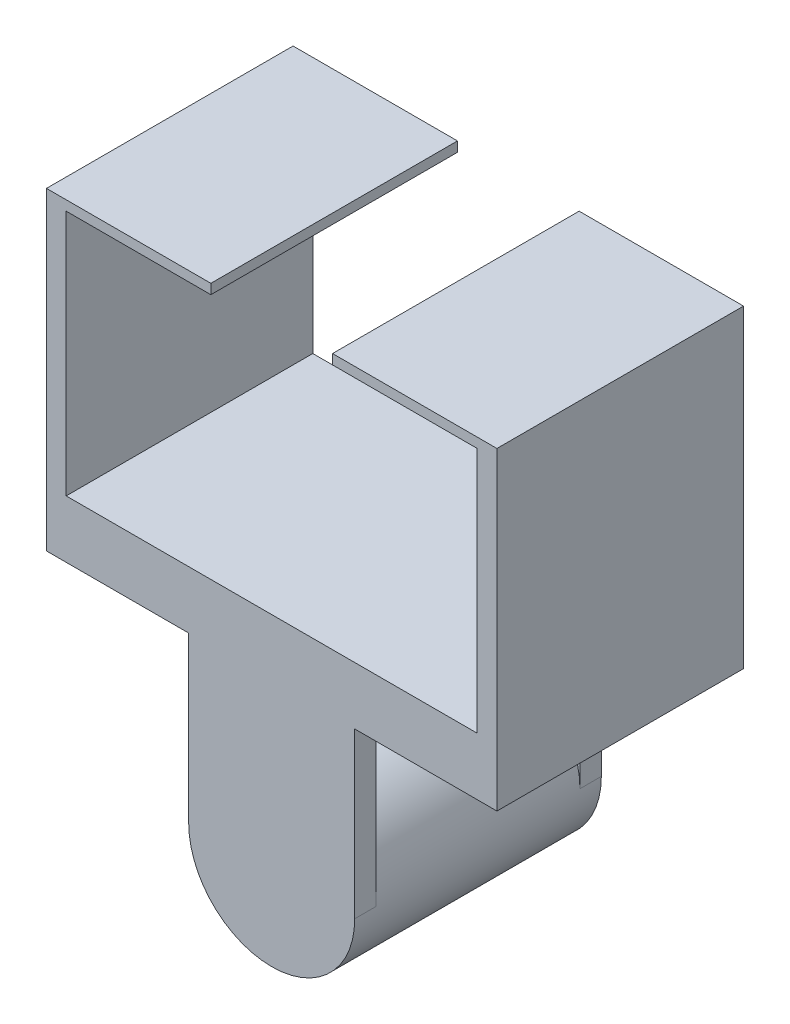
ISO-10303-21;
HEADER;
FILE_DESCRIPTION(('STEP AP214'),'2;1');
FILE_NAME('part.step','',(''),(''),'','','');
FILE_SCHEMA(('AUTOMOTIVE_DESIGN { 1 0 10303 214 1 1 1 1 }'));
ENDSEC;
DATA;
#1=APPLICATION_CONTEXT('core data for automotive mechanical design processes');
#2=APPLICATION_PROTOCOL_DEFINITION('international standard','automotive_design',2000,#1);
#3=PRODUCT_CONTEXT('',#1,'mechanical');
#4=PRODUCT('Part','Part','',(#3));
#5=PRODUCT_RELATED_PRODUCT_CATEGORY('part','',(#4));
#6=PRODUCT_DEFINITION_FORMATION('','',#4);
#7=PRODUCT_DEFINITION_CONTEXT('part definition',#1,'design');
#8=PRODUCT_DEFINITION('design','',#6,#7);
#9=PRODUCT_DEFINITION_SHAPE('','',#8);
#10=(LENGTH_UNIT() NAMED_UNIT(*) SI_UNIT(.MILLI.,.METRE.));
#11=(NAMED_UNIT(*) PLANE_ANGLE_UNIT() SI_UNIT($,.RADIAN.));
#12=(NAMED_UNIT(*) SI_UNIT($,.STERADIAN.) SOLID_ANGLE_UNIT());
#13=UNCERTAINTY_MEASURE_WITH_UNIT(LENGTH_MEASURE(1.E-05),#10,'distance_accuracy_value','');
#14=(GEOMETRIC_REPRESENTATION_CONTEXT(3) GLOBAL_UNCERTAINTY_ASSIGNED_CONTEXT((#13)) GLOBAL_UNIT_ASSIGNED_CONTEXT((#10,
#11,#12)) REPRESENTATION_CONTEXT('',''));
#15=CARTESIAN_POINT('',(0.,0.,0.));
#16=DIRECTION('',(0.,0.,1.));
#17=DIRECTION('',(1.,0.,0.));
#18=AXIS2_PLACEMENT_3D('',#15,#16,#17);
#19=CARTESIAN_POINT('',(0.,-30.1017640511618,38.1));
#20=DIRECTION('',(0.,0.,-1.));
#21=DIRECTION('',(-1.,0.,0.));
#22=AXIS2_PLACEMENT_3D('',#19,#20,#21);
#23=CYLINDRICAL_SURFACE('',#22,12.827);
#24=CARTESIAN_POINT('',(0.,-30.1017640511618,38.1));
#25=DIRECTION('',(0.,0.,1.));
#26=DIRECTION('',(1.,0.,0.));
#27=AXIS2_PLACEMENT_3D('',#24,#25,#26);
#28=CIRCLE('',#27,12.827);
#29=CARTESIAN_POINT('',(-12.827,-30.1017640511618,38.1));
#30=VERTEX_POINT('',#29);
#31=CARTESIAN_POINT('',(12.827,-30.1017640511618,38.1));
#32=VERTEX_POINT('',#31);
#33=EDGE_CURVE('E55',#30,#32,#28,.T.);
#34=ORIENTED_EDGE('',*,*,#33,.F.);
#35=DIRECTION('',(0.,0.,1.));
#36=VECTOR('',#35,1.);
#37=CARTESIAN_POINT('',(-12.827,-30.1017640511618,34.798));
#38=LINE('',#37,#36);
#39=CARTESIAN_POINT('',(-12.827,-30.1017640511618,34.798));
#40=VERTEX_POINT('',#39);
#41=EDGE_CURVE('E206',#40,#30,#38,.T.);
#42=ORIENTED_EDGE('',*,*,#41,.F.);
#43=CARTESIAN_POINT('',(0.,-30.1017640511618,34.798));
#44=DIRECTION('',(0.,0.,-1.));
#45=DIRECTION('',(-1.,0.,0.));
#46=AXIS2_PLACEMENT_3D('',#43,#44,#45);
#47=CIRCLE('',#46,12.827);
#48=CARTESIAN_POINT('',(12.827,-30.1017640511618,34.798));
#49=VERTEX_POINT('',#48);
#50=EDGE_CURVE('E198',#40,#49,#47,.T.);
#51=ORIENTED_EDGE('',*,*,#50,.T.);
#52=DIRECTION('',(0.,0.,1.));
#53=VECTOR('',#52,1.);
#54=CARTESIAN_POINT('',(12.827,-30.1017640511618,34.798));
#55=LINE('',#54,#53);
#56=EDGE_CURVE('E183',#49,#32,#55,.T.);
#57=ORIENTED_EDGE('',*,*,#56,.T.);
#58=EDGE_LOOP('',(#34,#42,#51,#57));
#59=FACE_BOUND('',#58,.T.);
#60=DIRECTION('',(0.,0.,-1.));
#61=VECTOR('',#60,1.);
#62=CARTESIAN_POINT('',(-12.827,-30.1017640511618,3.302));
#63=LINE('',#62,#61);
#64=CARTESIAN_POINT('',(-12.827,-30.1017640511618,3.302));
#65=VERTEX_POINT('',#64);
#66=CARTESIAN_POINT('',(-12.827,-30.1017640511618,0.));
#67=VERTEX_POINT('',#66);
#68=EDGE_CURVE('E375',#65,#67,#63,.T.);
#69=ORIENTED_EDGE('',*,*,#68,.T.);
#70=CARTESIAN_POINT('',(0.,-30.1017640511618,0.));
#71=DIRECTION('',(0.,0.,1.));
#72=DIRECTION('',(1.,0.,0.));
#73=AXIS2_PLACEMENT_3D('',#70,#71,#72);
#74=CIRCLE('',#73,12.827);
#75=CARTESIAN_POINT('',(12.827,-30.1017640511618,0.));
#76=VERTEX_POINT('',#75);
#77=EDGE_CURVE('E379',#67,#76,#74,.T.);
#78=ORIENTED_EDGE('',*,*,#77,.T.);
#79=DIRECTION('',(0.,0.,-1.));
#80=VECTOR('',#79,1.);
#81=CARTESIAN_POINT('',(12.827,-30.1017640511618,3.302));
#82=LINE('',#81,#80);
#83=CARTESIAN_POINT('',(12.827,-30.1017640511618,3.302));
#84=VERTEX_POINT('',#83);
#85=EDGE_CURVE('E371',#84,#76,#82,.T.);
#86=ORIENTED_EDGE('',*,*,#85,.F.);
#87=CARTESIAN_POINT('',(0.,-30.1017640511618,3.302));
#88=DIRECTION('',(0.,0.,-1.));
#89=DIRECTION('',(-1.,0.,0.));
#90=AXIS2_PLACEMENT_3D('',#87,#88,#89);
#91=CIRCLE('',#90,12.827);
#92=EDGE_CURVE('E11',#65,#84,#91,.T.);
#93=ORIENTED_EDGE('',*,*,#92,.F.);
#94=EDGE_LOOP('',(#69,#78,#86,#93));
#95=FACE_BOUND('',#94,.T.);
#96=ADVANCED_FACE('F47',(#59,#95),#23,.T.);
#97=CARTESIAN_POINT('',(0.,-30.1017640511618,38.1));
#98=DIRECTION('',(0.,0.,1.));
#99=DIRECTION('',(1.,0.,0.));
#100=AXIS2_PLACEMENT_3D('',#97,#98,#99);
#101=PLANE('',#100);
#102=ORIENTED_EDGE('',*,*,#33,.T.);
#103=DIRECTION('',(0.,1.,0.));
#104=VECTOR('',#103,1.);
#105=CARTESIAN_POINT('',(12.827,-4.70176405116185,38.1));
#106=LINE('',#105,#104);
#107=CARTESIAN_POINT('',(12.827,-4.70176405116185,38.1));
#108=VERTEX_POINT('',#107);
#109=EDGE_CURVE('E68',#32,#108,#106,.T.);
#110=ORIENTED_EDGE('',*,*,#109,.T.);
#111=DIRECTION('',(1.,0.,0.));
#112=VECTOR('',#111,1.);
#113=CARTESIAN_POINT('',(-31.75,-4.70176405116185,38.1));
#114=LINE('',#113,#112);
#115=CARTESIAN_POINT('',(34.798,-4.70176405116185,38.1));
#116=VERTEX_POINT('',#115);
#117=EDGE_CURVE('E313',#108,#116,#114,.T.);
#118=ORIENTED_EDGE('',*,*,#117,.T.);
#119=DIRECTION('',(0.,-1.,0.));
#120=VECTOR('',#119,1.);
#121=CARTESIAN_POINT('',(34.798,-4.70176405116185,38.1));
#122=LINE('',#121,#120);
#123=CARTESIAN_POINT('',(34.798,43.8122359488382,38.1));
#124=VERTEX_POINT('',#123);
#125=EDGE_CURVE('E301',#124,#116,#122,.T.);
#126=ORIENTED_EDGE('',*,*,#125,.F.);
#127=DIRECTION('',(1.,0.,0.));
#128=VECTOR('',#127,1.);
#129=CARTESIAN_POINT('',(34.798,43.8122359488382,38.1));
#130=LINE('',#129,#128);
#131=CARTESIAN_POINT('',(9.39800000000001,43.8122359488382,38.1));
#132=VERTEX_POINT('',#131);
#133=EDGE_CURVE('E258',#132,#124,#130,.T.);
#134=ORIENTED_EDGE('',*,*,#133,.F.);
#135=DIRECTION('',(0.,-1.,0.));
#136=VECTOR('',#135,1.);
#137=CARTESIAN_POINT('',(9.39800000000001,43.8122359488382,38.1));
#138=LINE('',#137,#136);
#139=CARTESIAN_POINT('',(9.39800000000001,42.2882359488382,38.1));
#140=VERTEX_POINT('',#139);
#141=EDGE_CURVE('E262',#132,#140,#138,.T.);
#142=ORIENTED_EDGE('',*,*,#141,.T.);
#143=DIRECTION('',(1.,0.,0.));
#144=VECTOR('',#143,1.);
#145=CARTESIAN_POINT('',(34.798,42.2882359488382,38.1));
#146=LINE('',#145,#144);
#147=CARTESIAN_POINT('',(31.75,42.2882359488382,38.1));
#148=VERTEX_POINT('',#147);
#149=EDGE_CURVE('E252',#140,#148,#146,.T.);
#150=ORIENTED_EDGE('',*,*,#149,.T.);
#151=DIRECTION('',(0.,-1.,0.));
#152=VECTOR('',#151,1.);
#153=CARTESIAN_POINT('',(31.75,-4.70176405116185,38.1));
#154=LINE('',#153,#152);
#155=CARTESIAN_POINT('',(31.75,4.18823594883815,38.1));
#156=VERTEX_POINT('',#155);
#157=EDGE_CURVE('E291',#148,#156,#154,.T.);
#158=ORIENTED_EDGE('',*,*,#157,.T.);
#159=DIRECTION('',(1.,0.,0.));
#160=VECTOR('',#159,1.);
#161=CARTESIAN_POINT('',(-31.75,4.18823594883815,38.1));
#162=LINE('',#161,#160);
#163=CARTESIAN_POINT('',(-31.75,4.18823594883815,38.1));
#164=VERTEX_POINT('',#163);
#165=EDGE_CURVE('E327',#164,#156,#162,.T.);
#166=ORIENTED_EDGE('',*,*,#165,.F.);
#167=DIRECTION('',(0.,1.,0.));
#168=VECTOR('',#167,1.);
#169=CARTESIAN_POINT('',(-31.75,-4.70176405116185,38.1));
#170=LINE('',#169,#168);
#171=CARTESIAN_POINT('',(-31.75,42.2882359488382,38.1));
#172=VERTEX_POINT('',#171);
#173=EDGE_CURVE('E278',#164,#172,#170,.T.);
#174=ORIENTED_EDGE('',*,*,#173,.T.);
#175=DIRECTION('',(1.,0.,0.));
#176=VECTOR('',#175,1.);
#177=CARTESIAN_POINT('',(-34.798,42.2882359488381,38.1));
#178=LINE('',#177,#176);
#179=CARTESIAN_POINT('',(-9.398,42.2882359488381,38.1));
#180=VERTEX_POINT('',#179);
#181=EDGE_CURVE('E208',#172,#180,#178,.T.);
#182=ORIENTED_EDGE('',*,*,#181,.T.);
#183=DIRECTION('',(0.,-1.,0.));
#184=VECTOR('',#183,1.);
#185=CARTESIAN_POINT('',(-9.398,43.8122359488381,38.1));
#186=LINE('',#185,#184);
#187=CARTESIAN_POINT('',(-9.398,43.8122359488381,38.1));
#188=VERTEX_POINT('',#187);
#189=EDGE_CURVE('E242',#188,#180,#186,.T.);
#190=ORIENTED_EDGE('',*,*,#189,.F.);
#191=DIRECTION('',(1.,0.,0.));
#192=VECTOR('',#191,1.);
#193=CARTESIAN_POINT('',(-34.798,43.8122359488381,38.1));
#194=LINE('',#193,#192);
#195=CARTESIAN_POINT('',(-34.798,43.8122359488381,38.1));
#196=VERTEX_POINT('',#195);
#197=EDGE_CURVE('E222',#196,#188,#194,.T.);
#198=ORIENTED_EDGE('',*,*,#197,.F.);
#199=DIRECTION('',(0.,1.,0.));
#200=VECTOR('',#199,1.);
#201=CARTESIAN_POINT('',(-34.798,-4.70176405116185,38.1));
#202=LINE('',#201,#200);
#203=CARTESIAN_POINT('',(-34.798,-4.70176405116185,38.1));
#204=VERTEX_POINT('',#203);
#205=EDGE_CURVE('E279',#204,#196,#202,.T.);
#206=ORIENTED_EDGE('',*,*,#205,.F.);
#207=CARTESIAN_POINT('',(-12.827,-4.70176405116185,38.1));
#208=VERTEX_POINT('',#207);
#209=EDGE_CURVE('E341',#204,#208,#114,.T.);
#210=ORIENTED_EDGE('',*,*,#209,.T.);
#211=DIRECTION('',(0.,-1.,0.));
#212=VECTOR('',#211,1.);
#213=CARTESIAN_POINT('',(-12.827,-30.1017640511618,38.1));
#214=LINE('',#213,#212);
#215=EDGE_CURVE('E62',#208,#30,#214,.T.);
#216=ORIENTED_EDGE('',*,*,#215,.T.);
#217=EDGE_LOOP('',(#102,#110,#118,#126,#134,#142,#150,#158,#166,#174,#182,#190,#198,#206,#210,#216));
#218=FACE_BOUND('',#217,.T.);
#219=ADVANCED_FACE('F402',(#218),#101,.T.);
#220=CARTESIAN_POINT('',(0.,-30.1017640511618,0.));
#221=DIRECTION('',(0.,0.,1.));
#222=DIRECTION('',(1.,0.,0.));
#223=AXIS2_PLACEMENT_3D('',#220,#221,#222);
#224=PLANE('',#223);
#225=ORIENTED_EDGE('',*,*,#77,.F.);
#226=DIRECTION('',(0.,-1.,0.));
#227=VECTOR('',#226,1.);
#228=CARTESIAN_POINT('',(-12.827,-30.1017640511618,0.));
#229=LINE('',#228,#227);
#230=CARTESIAN_POINT('',(-12.827,-4.70176405116185,0.));
#231=VERTEX_POINT('',#230);
#232=EDGE_CURVE('E340',#231,#67,#229,.T.);
#233=ORIENTED_EDGE('',*,*,#232,.F.);
#234=DIRECTION('',(-1.,0.,0.));
#235=VECTOR('',#234,1.);
#236=CARTESIAN_POINT('',(-31.75,-4.70176405116185,0.));
#237=LINE('',#236,#235);
#238=CARTESIAN_POINT('',(-34.798,-4.70176405116185,0.));
#239=VERTEX_POINT('',#238);
#240=EDGE_CURVE('E344',#231,#239,#237,.T.);
#241=ORIENTED_EDGE('',*,*,#240,.T.);
#242=DIRECTION('',(0.,-1.,0.));
#243=VECTOR('',#242,1.);
#244=CARTESIAN_POINT('',(-34.798,-4.70176405116185,0.));
#245=LINE('',#244,#243);
#246=CARTESIAN_POINT('',(-34.798,43.8122359488382,0.));
#247=VERTEX_POINT('',#246);
#248=EDGE_CURVE('E282',#247,#239,#245,.T.);
#249=ORIENTED_EDGE('',*,*,#248,.F.);
#250=DIRECTION('',(-1.,0.,0.));
#251=VECTOR('',#250,1.);
#252=CARTESIAN_POINT('',(-34.798,43.8122359488382,0.));
#253=LINE('',#252,#251);
#254=CARTESIAN_POINT('',(-9.398,43.8122359488382,0.));
#255=VERTEX_POINT('',#254);
#256=EDGE_CURVE('E229',#255,#247,#253,.T.);
#257=ORIENTED_EDGE('',*,*,#256,.F.);
#258=DIRECTION('',(0.,-1.,0.));
#259=VECTOR('',#258,1.);
#260=CARTESIAN_POINT('',(-9.398,43.8122359488382,0.));
#261=LINE('',#260,#259);
#262=CARTESIAN_POINT('',(-9.398,42.2882359488382,0.));
#263=VERTEX_POINT('',#262);
#264=EDGE_CURVE('E232',#255,#263,#261,.T.);
#265=ORIENTED_EDGE('',*,*,#264,.T.);
#266=DIRECTION('',(-1.,0.,0.));
#267=VECTOR('',#266,1.);
#268=CARTESIAN_POINT('',(-34.798,42.2882359488382,0.));
#269=LINE('',#268,#267);
#270=CARTESIAN_POINT('',(-31.75,42.2882359488382,0.));
#271=VERTEX_POINT('',#270);
#272=EDGE_CURVE('E223',#263,#271,#269,.T.);
#273=ORIENTED_EDGE('',*,*,#272,.T.);
#274=DIRECTION('',(0.,-1.,0.));
#275=VECTOR('',#274,1.);
#276=CARTESIAN_POINT('',(-31.75,-4.70176405116185,0.));
#277=LINE('',#276,#275);
#278=CARTESIAN_POINT('',(-31.75,4.18823594883815,0.));
#279=VERTEX_POINT('',#278);
#280=EDGE_CURVE('E283',#271,#279,#277,.T.);
#281=ORIENTED_EDGE('',*,*,#280,.T.);
#282=DIRECTION('',(-1.,0.,0.));
#283=VECTOR('',#282,1.);
#284=CARTESIAN_POINT('',(-31.75,4.18823594883815,0.));
#285=LINE('',#284,#283);
#286=CARTESIAN_POINT('',(31.75,4.18823594883815,0.));
#287=VERTEX_POINT('',#286);
#288=EDGE_CURVE('E336',#287,#279,#285,.T.);
#289=ORIENTED_EDGE('',*,*,#288,.F.);
#290=DIRECTION('',(0.,1.,0.));
#291=VECTOR('',#290,1.);
#292=CARTESIAN_POINT('',(31.75,-4.70176405116185,0.));
#293=LINE('',#292,#291);
#294=CARTESIAN_POINT('',(31.75,42.2882359488382,0.));
#295=VERTEX_POINT('',#294);
#296=EDGE_CURVE('E317',#287,#295,#293,.T.);
#297=ORIENTED_EDGE('',*,*,#296,.T.);
#298=DIRECTION('',(-1.,0.,0.));
#299=VECTOR('',#298,1.);
#300=CARTESIAN_POINT('',(34.798,42.2882359488382,0.));
#301=LINE('',#300,#299);
#302=CARTESIAN_POINT('',(9.39800000000001,42.2882359488382,0.));
#303=VERTEX_POINT('',#302);
#304=EDGE_CURVE('E246',#295,#303,#301,.T.);
#305=ORIENTED_EDGE('',*,*,#304,.T.);
#306=DIRECTION('',(0.,-1.,0.));
#307=VECTOR('',#306,1.);
#308=CARTESIAN_POINT('',(9.39800000000001,43.8122359488382,0.));
#309=LINE('',#308,#307);
#310=CARTESIAN_POINT('',(9.39800000000001,43.8122359488382,0.));
#311=VERTEX_POINT('',#310);
#312=EDGE_CURVE('E274',#311,#303,#309,.T.);
#313=ORIENTED_EDGE('',*,*,#312,.F.);
#314=DIRECTION('',(-1.,0.,0.));
#315=VECTOR('',#314,1.);
#316=CARTESIAN_POINT('',(34.798,43.8122359488382,0.));
#317=LINE('',#316,#315);
#318=CARTESIAN_POINT('',(34.798,43.8122359488382,0.));
#319=VERTEX_POINT('',#318);
#320=EDGE_CURVE('E251',#319,#311,#317,.T.);
#321=ORIENTED_EDGE('',*,*,#320,.F.);
#322=DIRECTION('',(0.,1.,0.));
#323=VECTOR('',#322,1.);
#324=CARTESIAN_POINT('',(34.798,-4.70176405116185,0.));
#325=LINE('',#324,#323);
#326=CARTESIAN_POINT('',(34.798,-4.70176405116185,0.));
#327=VERTEX_POINT('',#326);
#328=EDGE_CURVE('E310',#327,#319,#325,.T.);
#329=ORIENTED_EDGE('',*,*,#328,.F.);
#330=CARTESIAN_POINT('',(12.827,-4.70176405116185,0.));
#331=VERTEX_POINT('',#330);
#332=EDGE_CURVE('E328',#327,#331,#237,.T.);
#333=ORIENTED_EDGE('',*,*,#332,.T.);
#334=DIRECTION('',(0.,1.,0.));
#335=VECTOR('',#334,1.);
#336=CARTESIAN_POINT('',(12.827,-30.1017640511618,0.));
#337=LINE('',#336,#335);
#338=EDGE_CURVE('E353',#76,#331,#337,.T.);
#339=ORIENTED_EDGE('',*,*,#338,.F.);
#340=EDGE_LOOP('',(#225,#233,#241,#249,#257,#265,#273,#281,#289,#297,#305,#313,#321,#329,#333,#339));
#341=FACE_BOUND('',#340,.T.);
#342=ADVANCED_FACE('F390',(#341),#224,.F.);
#343=CARTESIAN_POINT('',(-12.827,-30.1017640511618,3.302));
#344=DIRECTION('',(1.,0.,0.));
#345=DIRECTION('',(0.,0.,-1.));
#346=AXIS2_PLACEMENT_3D('',#343,#344,#345);
#347=PLANE('',#346);
#348=ORIENTED_EDGE('',*,*,#232,.T.);
#349=ORIENTED_EDGE('',*,*,#68,.F.);
#350=DIRECTION('',(0.,-1.,0.));
#351=VECTOR('',#350,1.);
#352=CARTESIAN_POINT('',(-12.827,-30.1017640511618,3.302));
#353=LINE('',#352,#351);
#354=CARTESIAN_POINT('',(-12.827,-4.70176405116185,3.302));
#355=VERTEX_POINT('',#354);
#356=EDGE_CURVE('E348',#355,#65,#353,.T.);
#357=ORIENTED_EDGE('',*,*,#356,.F.);
#358=DIRECTION('',(0.,0.,-1.));
#359=VECTOR('',#358,1.);
#360=CARTESIAN_POINT('',(-12.827,-4.70176405116185,3.302));
#361=LINE('',#360,#359);
#362=EDGE_CURVE('E359',#355,#231,#361,.T.);
#363=ORIENTED_EDGE('',*,*,#362,.T.);
#364=EDGE_LOOP('',(#348,#349,#357,#363));
#365=FACE_BOUND('',#364,.T.);
#366=ADVANCED_FACE('F478',(#365),#347,.F.);
#367=CARTESIAN_POINT('',(12.827,-30.1017640511618,3.302));
#368=DIRECTION('',(-1.,0.,0.));
#369=DIRECTION('',(0.,0.,1.));
#370=AXIS2_PLACEMENT_3D('',#367,#368,#369);
#371=PLANE('',#370);
#372=ORIENTED_EDGE('',*,*,#338,.T.);
#373=DIRECTION('',(0.,0.,-1.));
#374=VECTOR('',#373,1.);
#375=CARTESIAN_POINT('',(12.827,-4.70176405116185,3.302));
#376=LINE('',#375,#374);
#377=CARTESIAN_POINT('',(12.827,-4.70176405116185,3.302));
#378=VERTEX_POINT('',#377);
#379=EDGE_CURVE('E367',#378,#331,#376,.T.);
#380=ORIENTED_EDGE('',*,*,#379,.F.);
#381=DIRECTION('',(0.,1.,0.));
#382=VECTOR('',#381,1.);
#383=CARTESIAN_POINT('',(12.827,-30.1017640511618,3.302));
#384=LINE('',#383,#382);
#385=EDGE_CURVE('E352',#84,#378,#384,.T.);
#386=ORIENTED_EDGE('',*,*,#385,.F.);
#387=ORIENTED_EDGE('',*,*,#85,.T.);
#388=EDGE_LOOP('',(#372,#380,#386,#387));
#389=FACE_BOUND('',#388,.T.);
#390=ADVANCED_FACE('F388',(#389),#371,.F.);
#391=CARTESIAN_POINT('',(0.,0.,3.302));
#392=DIRECTION('',(0.,0.,-1.));
#393=DIRECTION('',(-1.,0.,0.));
#394=AXIS2_PLACEMENT_3D('',#391,#392,#393);
#395=PLANE('',#394);
#396=ORIENTED_EDGE('',*,*,#356,.T.);
#397=ORIENTED_EDGE('',*,*,#92,.T.);
#398=ORIENTED_EDGE('',*,*,#385,.T.);
#399=DIRECTION('',(-1.,0.,0.));
#400=VECTOR('',#399,1.);
#401=CARTESIAN_POINT('',(-12.827,-4.70176405116185,3.302));
#402=LINE('',#401,#400);
#403=EDGE_CURVE('E356',#378,#355,#402,.T.);
#404=ORIENTED_EDGE('',*,*,#403,.T.);
#405=EDGE_LOOP('',(#396,#397,#398,#404));
#406=FACE_BOUND('',#405,.T.);
#407=ADVANCED_FACE('F485',(#406),#395,.F.);
#408=CARTESIAN_POINT('',(0.,4.18823594883815,0.));
#409=DIRECTION('',(0.,1.,0.));
#410=DIRECTION('',(0.,0.,1.));
#411=AXIS2_PLACEMENT_3D('',#408,#409,#410);
#412=PLANE('',#411);
#413=DIRECTION('',(0.,0.,1.));
#414=VECTOR('',#413,1.);
#415=CARTESIAN_POINT('',(-31.75,4.18823594883815,0.));
#416=LINE('',#415,#414);
#417=EDGE_CURVE('E323',#279,#164,#416,.T.);
#418=ORIENTED_EDGE('',*,*,#417,.T.);
#419=ORIENTED_EDGE('',*,*,#165,.T.);
#420=DIRECTION('',(0.,0.,-1.));
#421=VECTOR('',#420,1.);
#422=CARTESIAN_POINT('',(31.75,4.18823594883815,0.));
#423=LINE('',#422,#421);
#424=EDGE_CURVE('E332',#156,#287,#423,.T.);
#425=ORIENTED_EDGE('',*,*,#424,.T.);
#426=ORIENTED_EDGE('',*,*,#288,.T.);
#427=EDGE_LOOP('',(#418,#419,#425,#426));
#428=FACE_BOUND('',#427,.T.);
#429=ADVANCED_FACE('F420',(#428),#412,.T.);
#430=CARTESIAN_POINT('',(0.,-4.70176405116185,0.));
#431=DIRECTION('',(0.,1.,0.));
#432=DIRECTION('',(0.,0.,1.));
#433=AXIS2_PLACEMENT_3D('',#430,#431,#432);
#434=PLANE('',#433);
#435=DIRECTION('',(-1.,0.,0.));
#436=VECTOR('',#435,1.);
#437=CARTESIAN_POINT('',(-12.827,-4.70176405116185,34.798));
#438=LINE('',#437,#436);
#439=CARTESIAN_POINT('',(12.827,-4.70176405116185,34.798));
#440=VERTEX_POINT('',#439);
#441=CARTESIAN_POINT('',(-12.827,-4.70176405116185,34.798));
#442=VERTEX_POINT('',#441);
#443=EDGE_CURVE('E201',#440,#442,#438,.T.);
#444=ORIENTED_EDGE('',*,*,#443,.T.);
#445=DIRECTION('',(0.,0.,1.));
#446=VECTOR('',#445,1.);
#447=CARTESIAN_POINT('',(-12.827,-4.70176405116185,34.798));
#448=LINE('',#447,#446);
#449=EDGE_CURVE('E214',#442,#208,#448,.T.);
#450=ORIENTED_EDGE('',*,*,#449,.T.);
#451=ORIENTED_EDGE('',*,*,#209,.F.);
#452=DIRECTION('',(0.,0.,1.));
#453=VECTOR('',#452,1.);
#454=CARTESIAN_POINT('',(-34.798,-4.70176405116185,38.1));
#455=LINE('',#454,#453);
#456=EDGE_CURVE('E287',#239,#204,#455,.T.);
#457=ORIENTED_EDGE('',*,*,#456,.F.);
#458=ORIENTED_EDGE('',*,*,#240,.F.);
#459=ORIENTED_EDGE('',*,*,#362,.F.);
#460=ORIENTED_EDGE('',*,*,#403,.F.);
#461=ORIENTED_EDGE('',*,*,#379,.T.);
#462=ORIENTED_EDGE('',*,*,#332,.F.);
#463=DIRECTION('',(0.,0.,-1.));
#464=VECTOR('',#463,1.);
#465=CARTESIAN_POINT('',(34.798,-4.70176405116185,38.1));
#466=LINE('',#465,#464);
#467=EDGE_CURVE('E305',#116,#327,#466,.T.);
#468=ORIENTED_EDGE('',*,*,#467,.F.);
#469=ORIENTED_EDGE('',*,*,#117,.F.);
#470=DIRECTION('',(0.,0.,1.));
#471=VECTOR('',#470,1.);
#472=CARTESIAN_POINT('',(12.827,-4.70176405116185,34.798));
#473=LINE('',#472,#471);
#474=EDGE_CURVE('E192',#440,#108,#473,.T.);
#475=ORIENTED_EDGE('',*,*,#474,.F.);
#476=EDGE_LOOP('',(#444,#450,#451,#457,#458,#459,#460,#461,#462,#468,#469,#475));
#477=FACE_BOUND('',#476,.T.);
#478=ADVANCED_FACE('F395',(#477),#434,.F.);
#479=CARTESIAN_POINT('',(31.75,0.,0.));
#480=DIRECTION('',(-1.,0.,0.));
#481=DIRECTION('',(0.,0.,1.));
#482=AXIS2_PLACEMENT_3D('',#479,#480,#481);
#483=PLANE('',#482);
#484=ORIENTED_EDGE('',*,*,#424,.F.);
#485=ORIENTED_EDGE('',*,*,#157,.F.);
#486=DIRECTION('',(0.,0.,1.));
#487=VECTOR('',#486,1.);
#488=CARTESIAN_POINT('',(31.75,42.2882359488382,38.1));
#489=LINE('',#488,#487);
#490=EDGE_CURVE('E306',#295,#148,#489,.T.);
#491=ORIENTED_EDGE('',*,*,#490,.F.);
#492=ORIENTED_EDGE('',*,*,#296,.F.);
#493=EDGE_LOOP('',(#484,#485,#491,#492));
#494=FACE_BOUND('',#493,.T.);
#495=ADVANCED_FACE('F417',(#494),#483,.T.);
#496=CARTESIAN_POINT('',(34.798,0.,0.));
#497=DIRECTION('',(-1.,0.,0.));
#498=DIRECTION('',(0.,0.,1.));
#499=AXIS2_PLACEMENT_3D('',#496,#497,#498);
#500=PLANE('',#499);
#501=ORIENTED_EDGE('',*,*,#125,.T.);
#502=ORIENTED_EDGE('',*,*,#467,.T.);
#503=ORIENTED_EDGE('',*,*,#328,.T.);
#504=DIRECTION('',(0.,0.,-1.));
#505=VECTOR('',#504,1.);
#506=CARTESIAN_POINT('',(34.798,43.8122359488382,38.1));
#507=LINE('',#506,#505);
#508=EDGE_CURVE('E247',#124,#319,#507,.T.);
#509=ORIENTED_EDGE('',*,*,#508,.F.);
#510=EDGE_LOOP('',(#501,#502,#503,#509));
#511=FACE_BOUND('',#510,.T.);
#512=ADVANCED_FACE('F399',(#511),#500,.F.);
#513=CARTESIAN_POINT('',(-34.798,0.,0.));
#514=DIRECTION('',(-1.,0.,0.));
#515=DIRECTION('',(0.,0.,1.));
#516=AXIS2_PLACEMENT_3D('',#513,#514,#515);
#517=PLANE('',#516);
#518=ORIENTED_EDGE('',*,*,#205,.T.);
#519=DIRECTION('',(0.,0.,1.));
#520=VECTOR('',#519,1.);
#521=CARTESIAN_POINT('',(-34.798,43.8122359488381,38.1));
#522=LINE('',#521,#520);
#523=EDGE_CURVE('E218',#247,#196,#522,.T.);
#524=ORIENTED_EDGE('',*,*,#523,.F.);
#525=ORIENTED_EDGE('',*,*,#248,.T.);
#526=ORIENTED_EDGE('',*,*,#456,.T.);
#527=EDGE_LOOP('',(#518,#524,#525,#526));
#528=FACE_BOUND('',#527,.T.);
#529=ADVANCED_FACE('F442',(#528),#517,.T.);
#530=CARTESIAN_POINT('',(-31.75,0.,0.));
#531=DIRECTION('',(-1.,0.,0.));
#532=DIRECTION('',(0.,0.,1.));
#533=AXIS2_PLACEMENT_3D('',#530,#531,#532);
#534=PLANE('',#533);
#535=ORIENTED_EDGE('',*,*,#417,.F.);
#536=ORIENTED_EDGE('',*,*,#280,.F.);
#537=DIRECTION('',(0.,0.,-1.));
#538=VECTOR('',#537,1.);
#539=CARTESIAN_POINT('',(-31.75,42.2882359488382,38.1));
#540=LINE('',#539,#538);
#541=EDGE_CURVE('E294',#172,#271,#540,.T.);
#542=ORIENTED_EDGE('',*,*,#541,.F.);
#543=ORIENTED_EDGE('',*,*,#173,.F.);
#544=EDGE_LOOP('',(#535,#536,#542,#543));
#545=FACE_BOUND('',#544,.T.);
#546=ADVANCED_FACE('F423',(#545),#534,.F.);
#547=CARTESIAN_POINT('',(9.39800000000001,43.8122359488382,38.1));
#548=DIRECTION('',(1.,0.,0.));
#549=DIRECTION('',(0.,0.,-1.));
#550=AXIS2_PLACEMENT_3D('',#547,#548,#549);
#551=PLANE('',#550);
#552=DIRECTION('',(0.,0.,1.));
#553=VECTOR('',#552,1.);
#554=CARTESIAN_POINT('',(9.39800000000001,42.2882359488382,38.1));
#555=LINE('',#554,#553);
#556=EDGE_CURVE('E265',#303,#140,#555,.T.);
#557=ORIENTED_EDGE('',*,*,#556,.T.);
#558=ORIENTED_EDGE('',*,*,#141,.F.);
#559=DIRECTION('',(0.,0.,1.));
#560=VECTOR('',#559,1.);
#561=CARTESIAN_POINT('',(9.39800000000001,43.8122359488382,38.1));
#562=LINE('',#561,#560);
#563=EDGE_CURVE('E255',#311,#132,#562,.T.);
#564=ORIENTED_EDGE('',*,*,#563,.F.);
#565=ORIENTED_EDGE('',*,*,#312,.T.);
#566=EDGE_LOOP('',(#557,#558,#564,#565));
#567=FACE_BOUND('',#566,.T.);
#568=ADVANCED_FACE('F409',(#567),#551,.F.);
#569=CARTESIAN_POINT('',(0.,43.8122359488382,0.));
#570=DIRECTION('',(0.,1.,0.));
#571=DIRECTION('',(0.,0.,1.));
#572=AXIS2_PLACEMENT_3D('',#569,#570,#571);
#573=PLANE('',#572);
#574=ORIENTED_EDGE('',*,*,#508,.T.);
#575=ORIENTED_EDGE('',*,*,#320,.T.);
#576=ORIENTED_EDGE('',*,*,#563,.T.);
#577=ORIENTED_EDGE('',*,*,#133,.T.);
#578=EDGE_LOOP('',(#574,#575,#576,#577));
#579=FACE_BOUND('',#578,.T.);
#580=ADVANCED_FACE('F404',(#579),#573,.T.);
#581=CARTESIAN_POINT('',(0.,42.2882359488382,0.));
#582=DIRECTION('',(0.,1.,0.));
#583=DIRECTION('',(0.,0.,1.));
#584=AXIS2_PLACEMENT_3D('',#581,#582,#583);
#585=PLANE('',#584);
#586=ORIENTED_EDGE('',*,*,#490,.T.);
#587=ORIENTED_EDGE('',*,*,#149,.F.);
#588=ORIENTED_EDGE('',*,*,#556,.F.);
#589=ORIENTED_EDGE('',*,*,#304,.F.);
#590=EDGE_LOOP('',(#586,#587,#588,#589));
#591=FACE_BOUND('',#590,.T.);
#592=ADVANCED_FACE('F414',(#591),#585,.F.);
#593=CARTESIAN_POINT('',(0.,42.2882359488382,0.));
#594=DIRECTION('',(0.,-1.,0.));
#595=DIRECTION('',(0.,0.,-1.));
#596=AXIS2_PLACEMENT_3D('',#593,#594,#595);
#597=PLANE('',#596);
#598=ORIENTED_EDGE('',*,*,#541,.T.);
#599=ORIENTED_EDGE('',*,*,#272,.F.);
#600=DIRECTION('',(0.,0.,-1.));
#601=VECTOR('',#600,1.);
#602=CARTESIAN_POINT('',(-9.398,42.2882359488381,38.1));
#603=LINE('',#602,#601);
#604=EDGE_CURVE('E212',#180,#263,#603,.T.);
#605=ORIENTED_EDGE('',*,*,#604,.F.);
#606=ORIENTED_EDGE('',*,*,#181,.F.);
#607=EDGE_LOOP('',(#598,#599,#605,#606));
#608=FACE_BOUND('',#607,.T.);
#609=ADVANCED_FACE('F430',(#608),#597,.T.);
#610=CARTESIAN_POINT('',(-9.398,43.8122359488381,38.1));
#611=DIRECTION('',(-1.,0.,0.));
#612=DIRECTION('',(0.,0.,1.));
#613=AXIS2_PLACEMENT_3D('',#610,#611,#612);
#614=PLANE('',#613);
#615=ORIENTED_EDGE('',*,*,#604,.T.);
#616=ORIENTED_EDGE('',*,*,#264,.F.);
#617=DIRECTION('',(0.,0.,-1.));
#618=VECTOR('',#617,1.);
#619=CARTESIAN_POINT('',(-9.398,43.8122359488381,38.1));
#620=LINE('',#619,#618);
#621=EDGE_CURVE('E226',#188,#255,#620,.T.);
#622=ORIENTED_EDGE('',*,*,#621,.F.);
#623=ORIENTED_EDGE('',*,*,#189,.T.);
#624=EDGE_LOOP('',(#615,#616,#622,#623));
#625=FACE_BOUND('',#624,.T.);
#626=ADVANCED_FACE('F436',(#625),#614,.F.);
#627=CARTESIAN_POINT('',(0.,43.8122359488382,0.));
#628=DIRECTION('',(0.,-1.,0.));
#629=DIRECTION('',(0.,0.,-1.));
#630=AXIS2_PLACEMENT_3D('',#627,#628,#629);
#631=PLANE('',#630);
#632=ORIENTED_EDGE('',*,*,#523,.T.);
#633=ORIENTED_EDGE('',*,*,#197,.T.);
#634=ORIENTED_EDGE('',*,*,#621,.T.);
#635=ORIENTED_EDGE('',*,*,#256,.T.);
#636=EDGE_LOOP('',(#632,#633,#634,#635));
#637=FACE_BOUND('',#636,.T.);
#638=ADVANCED_FACE('F438',(#637),#631,.F.);
#639=CARTESIAN_POINT('',(0.,0.,34.798));
#640=DIRECTION('',(0.,0.,-1.));
#641=DIRECTION('',(-1.,0.,0.));
#642=AXIS2_PLACEMENT_3D('',#639,#640,#641);
#643=PLANE('',#642);
#644=ORIENTED_EDGE('',*,*,#50,.F.);
#645=DIRECTION('',(0.,-1.,0.));
#646=VECTOR('',#645,1.);
#647=CARTESIAN_POINT('',(-12.827,-30.1017640511618,34.798));
#648=LINE('',#647,#646);
#649=EDGE_CURVE('E193',#442,#40,#648,.T.);
#650=ORIENTED_EDGE('',*,*,#649,.F.);
#651=ORIENTED_EDGE('',*,*,#443,.F.);
#652=DIRECTION('',(0.,1.,0.));
#653=VECTOR('',#652,1.);
#654=CARTESIAN_POINT('',(12.827,-4.70176405116185,34.798));
#655=LINE('',#654,#653);
#656=EDGE_CURVE('E186',#49,#440,#655,.T.);
#657=ORIENTED_EDGE('',*,*,#656,.F.);
#658=EDGE_LOOP('',(#644,#650,#651,#657));
#659=FACE_BOUND('',#658,.T.);
#660=ADVANCED_FACE('F196',(#659),#643,.T.);
#661=CARTESIAN_POINT('',(-12.827,-30.1017640511618,34.798));
#662=DIRECTION('',(-1.,0.,0.));
#663=DIRECTION('',(0.,0.,1.));
#664=AXIS2_PLACEMENT_3D('',#661,#662,#663);
#665=PLANE('',#664);
#666=ORIENTED_EDGE('',*,*,#215,.F.);
#667=ORIENTED_EDGE('',*,*,#449,.F.);
#668=ORIENTED_EDGE('',*,*,#649,.T.);
#669=ORIENTED_EDGE('',*,*,#41,.T.);
#670=EDGE_LOOP('',(#666,#667,#668,#669));
#671=FACE_BOUND('',#670,.T.);
#672=ADVANCED_FACE('F459',(#671),#665,.T.);
#673=CARTESIAN_POINT('',(12.827,-4.70176405116185,34.798));
#674=DIRECTION('',(1.,0.,0.));
#675=DIRECTION('',(0.,0.,-1.));
#676=AXIS2_PLACEMENT_3D('',#673,#674,#675);
#677=PLANE('',#676);
#678=ORIENTED_EDGE('',*,*,#109,.F.);
#679=ORIENTED_EDGE('',*,*,#56,.F.);
#680=ORIENTED_EDGE('',*,*,#656,.T.);
#681=ORIENTED_EDGE('',*,*,#474,.T.);
#682=EDGE_LOOP('',(#678,#679,#680,#681));
#683=FACE_BOUND('',#682,.T.);
#684=ADVANCED_FACE('F185',(#683),#677,.T.);
#685=CLOSED_SHELL('',(#96,#219,#342,#366,#390,#407,#429,#478,#495,#512,#529,#546,#568,#580,#592,
#609,#626,#638,#660,#672,#684));
#686=MANIFOLD_SOLID_BREP('B2',#685);
#687=ADVANCED_BREP_SHAPE_REPRESENTATION('',(#18,#686),#14);
#688=SHAPE_DEFINITION_REPRESENTATION(#9,#687);
ENDSEC;
END-ISO-10303-21;
